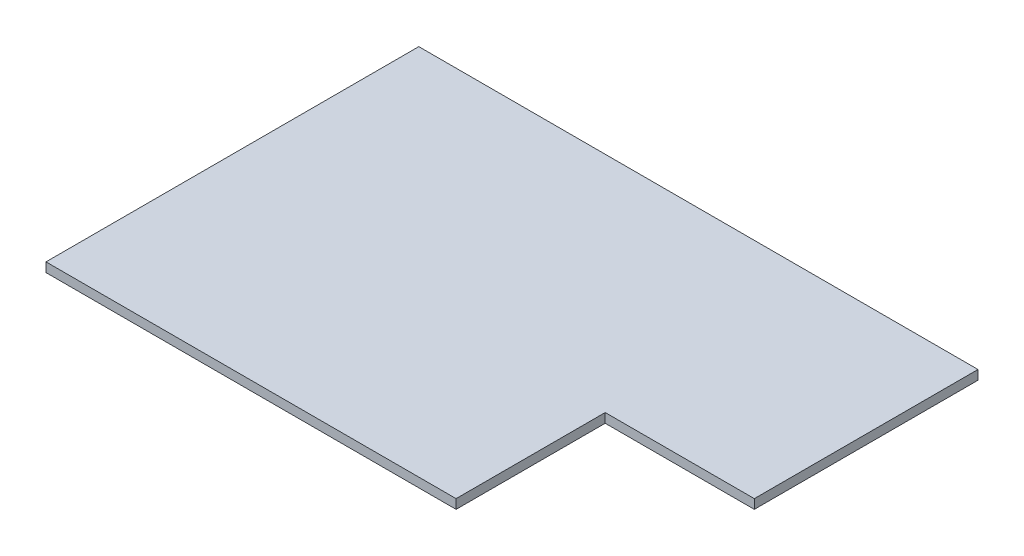
ISO-10303-21;
HEADER;
FILE_DESCRIPTION(('STEP AP214'),'2;1');
FILE_NAME('part.step','',(''),(''),'','','');
FILE_SCHEMA(('AUTOMOTIVE_DESIGN { 1 0 10303 214 1 1 1 1 }'));
ENDSEC;
DATA;
#1=APPLICATION_CONTEXT('core data for automotive mechanical design processes');
#2=APPLICATION_PROTOCOL_DEFINITION('international standard','automotive_design',2000,#1);
#3=PRODUCT_CONTEXT('',#1,'mechanical');
#4=PRODUCT('Part','Part','',(#3));
#5=PRODUCT_RELATED_PRODUCT_CATEGORY('part','',(#4));
#6=PRODUCT_DEFINITION_FORMATION('','',#4);
#7=PRODUCT_DEFINITION_CONTEXT('part definition',#1,'design');
#8=PRODUCT_DEFINITION('design','',#6,#7);
#9=PRODUCT_DEFINITION_SHAPE('','',#8);
#10=(LENGTH_UNIT() NAMED_UNIT(*) SI_UNIT(.MILLI.,.METRE.));
#11=(NAMED_UNIT(*) PLANE_ANGLE_UNIT() SI_UNIT($,.RADIAN.));
#12=(NAMED_UNIT(*) SI_UNIT($,.STERADIAN.) SOLID_ANGLE_UNIT());
#13=UNCERTAINTY_MEASURE_WITH_UNIT(LENGTH_MEASURE(1.E-05),#10,'distance_accuracy_value','');
#14=(GEOMETRIC_REPRESENTATION_CONTEXT(3) GLOBAL_UNCERTAINTY_ASSIGNED_CONTEXT((#13)) GLOBAL_UNIT_ASSIGNED_CONTEXT((#10,
#11,#12)) REPRESENTATION_CONTEXT('',''));
#15=CARTESIAN_POINT('',(0.,0.,0.));
#16=DIRECTION('',(0.,0.,1.));
#17=DIRECTION('',(1.,0.,0.));
#18=AXIS2_PLACEMENT_3D('',#15,#16,#17);
#19=CARTESIAN_POINT('',(95.25,3.175,63.5));
#20=DIRECTION('',(-1.,0.,0.));
#21=DIRECTION('',(0.,0.,1.));
#22=AXIS2_PLACEMENT_3D('',#19,#20,#21);
#23=PLANE('',#22);
#24=DIRECTION('',(0.,0.,-1.));
#25=VECTOR('',#24,1.);
#26=CARTESIAN_POINT('',(95.25,3.175,63.5));
#27=LINE('',#26,#25);
#28=CARTESIAN_POINT('',(95.25,3.175,12.7));
#29=VERTEX_POINT('',#28);
#30=CARTESIAN_POINT('',(95.25,3.175,-63.5));
#31=VERTEX_POINT('',#30);
#32=EDGE_CURVE('E79',#29,#31,#27,.T.);
#33=ORIENTED_EDGE('',*,*,#32,.F.);
#34=DIRECTION('',(0.,1.,0.));
#35=VECTOR('',#34,1.);
#36=CARTESIAN_POINT('',(95.25,0.,12.7));
#37=LINE('',#36,#35);
#38=CARTESIAN_POINT('',(95.25,0.,12.7));
#39=VERTEX_POINT('',#38);
#40=EDGE_CURVE('E99',#39,#29,#37,.T.);
#41=ORIENTED_EDGE('',*,*,#40,.F.);
#42=DIRECTION('',(0.,0.,-1.));
#43=VECTOR('',#42,1.);
#44=CARTESIAN_POINT('',(95.25,0.,63.5));
#45=LINE('',#44,#43);
#46=CARTESIAN_POINT('',(95.25,0.,-63.5));
#47=VERTEX_POINT('',#46);
#48=EDGE_CURVE('E107',#39,#47,#45,.T.);
#49=ORIENTED_EDGE('',*,*,#48,.T.);
#50=DIRECTION('',(0.,-1.,0.));
#51=VECTOR('',#50,1.);
#52=CARTESIAN_POINT('',(95.25,3.175,-63.5));
#53=LINE('',#52,#51);
#54=EDGE_CURVE('E11',#31,#47,#53,.T.);
#55=ORIENTED_EDGE('',*,*,#54,.F.);
#56=EDGE_LOOP('',(#33,#41,#49,#55));
#57=FACE_BOUND('',#56,.T.);
#58=ADVANCED_FACE('F34',(#57),#23,.F.);
#59=CARTESIAN_POINT('',(-95.25,3.175,-63.5));
#60=DIRECTION('',(0.,0.,1.));
#61=DIRECTION('',(1.,0.,0.));
#62=AXIS2_PLACEMENT_3D('',#59,#60,#61);
#63=PLANE('',#62);
#64=DIRECTION('',(-1.,0.,0.));
#65=VECTOR('',#64,1.);
#66=CARTESIAN_POINT('',(-95.25,0.,-63.5));
#67=LINE('',#66,#65);
#68=CARTESIAN_POINT('',(-95.25,0.,-63.5));
#69=VERTEX_POINT('',#68);
#70=EDGE_CURVE('E111',#47,#69,#67,.T.);
#71=ORIENTED_EDGE('',*,*,#70,.T.);
#72=DIRECTION('',(0.,-1.,0.));
#73=VECTOR('',#72,1.);
#74=CARTESIAN_POINT('',(-95.25,3.175,-63.5));
#75=LINE('',#74,#73);
#76=CARTESIAN_POINT('',(-95.25,3.175,-63.5));
#77=VERTEX_POINT('',#76);
#78=EDGE_CURVE('E41',#77,#69,#75,.T.);
#79=ORIENTED_EDGE('',*,*,#78,.F.);
#80=DIRECTION('',(-1.,0.,0.));
#81=VECTOR('',#80,1.);
#82=CARTESIAN_POINT('',(-95.25,3.175,-63.5));
#83=LINE('',#82,#81);
#84=EDGE_CURVE('E134',#31,#77,#83,.T.);
#85=ORIENTED_EDGE('',*,*,#84,.F.);
#86=ORIENTED_EDGE('',*,*,#54,.T.);
#87=EDGE_LOOP('',(#71,#79,#85,#86));
#88=FACE_BOUND('',#87,.T.);
#89=ADVANCED_FACE('F153',(#88),#63,.F.);
#90=CARTESIAN_POINT('',(-95.25,3.175,63.5));
#91=DIRECTION('',(1.,0.,0.));
#92=DIRECTION('',(0.,0.,-1.));
#93=AXIS2_PLACEMENT_3D('',#90,#91,#92);
#94=PLANE('',#93);
#95=DIRECTION('',(0.,0.,1.));
#96=VECTOR('',#95,1.);
#97=CARTESIAN_POINT('',(-95.25,0.,63.5));
#98=LINE('',#97,#96);
#99=CARTESIAN_POINT('',(-95.25,0.,63.5));
#100=VERTEX_POINT('',#99);
#101=EDGE_CURVE('E74',#69,#100,#98,.T.);
#102=ORIENTED_EDGE('',*,*,#101,.T.);
#103=DIRECTION('',(0.,-1.,0.));
#104=VECTOR('',#103,1.);
#105=CARTESIAN_POINT('',(-95.25,3.175,63.5));
#106=LINE('',#105,#104);
#107=CARTESIAN_POINT('',(-95.25,3.175,63.5));
#108=VERTEX_POINT('',#107);
#109=EDGE_CURVE('E125',#108,#100,#106,.T.);
#110=ORIENTED_EDGE('',*,*,#109,.F.);
#111=DIRECTION('',(0.,0.,1.));
#112=VECTOR('',#111,1.);
#113=CARTESIAN_POINT('',(-95.25,3.175,63.5));
#114=LINE('',#113,#112);
#115=EDGE_CURVE('E57',#77,#108,#114,.T.);
#116=ORIENTED_EDGE('',*,*,#115,.F.);
#117=ORIENTED_EDGE('',*,*,#78,.T.);
#118=EDGE_LOOP('',(#102,#110,#116,#117));
#119=FACE_BOUND('',#118,.T.);
#120=ADVANCED_FACE('F127',(#119),#94,.F.);
#121=CARTESIAN_POINT('',(-95.25,3.175,63.5));
#122=DIRECTION('',(0.,0.,-1.));
#123=DIRECTION('',(-1.,0.,0.));
#124=AXIS2_PLACEMENT_3D('',#121,#122,#123);
#125=PLANE('',#124);
#126=DIRECTION('',(1.,0.,0.));
#127=VECTOR('',#126,1.);
#128=CARTESIAN_POINT('',(-95.25,0.,63.5));
#129=LINE('',#128,#127);
#130=CARTESIAN_POINT('',(44.45,0.,63.5));
#131=VERTEX_POINT('',#130);
#132=EDGE_CURVE('E122',#100,#131,#129,.T.);
#133=ORIENTED_EDGE('',*,*,#132,.T.);
#134=DIRECTION('',(0.,1.,0.));
#135=VECTOR('',#134,1.);
#136=CARTESIAN_POINT('',(44.45,0.,63.5));
#137=LINE('',#136,#135);
#138=CARTESIAN_POINT('',(44.45,3.175,63.5));
#139=VERTEX_POINT('',#138);
#140=EDGE_CURVE('E112',#131,#139,#137,.T.);
#141=ORIENTED_EDGE('',*,*,#140,.T.);
#142=DIRECTION('',(1.,0.,0.));
#143=VECTOR('',#142,1.);
#144=CARTESIAN_POINT('',(-95.25,3.175,63.5));
#145=LINE('',#144,#143);
#146=EDGE_CURVE('E118',#108,#139,#145,.T.);
#147=ORIENTED_EDGE('',*,*,#146,.F.);
#148=ORIENTED_EDGE('',*,*,#109,.T.);
#149=EDGE_LOOP('',(#133,#141,#147,#148));
#150=FACE_BOUND('',#149,.T.);
#151=ADVANCED_FACE('F131',(#150),#125,.F.);
#152=CARTESIAN_POINT('',(0.,3.175,0.));
#153=DIRECTION('',(0.,-1.,0.));
#154=DIRECTION('',(0.,0.,-1.));
#155=AXIS2_PLACEMENT_3D('',#152,#153,#154);
#156=PLANE('',#155);
#157=ORIENTED_EDGE('',*,*,#146,.T.);
#158=DIRECTION('',(0.,0.,1.));
#159=VECTOR('',#158,1.);
#160=CARTESIAN_POINT('',(44.45,3.175,63.5));
#161=LINE('',#160,#159);
#162=CARTESIAN_POINT('',(44.45,3.175,12.7));
#163=VERTEX_POINT('',#162);
#164=EDGE_CURVE('E103',#163,#139,#161,.T.);
#165=ORIENTED_EDGE('',*,*,#164,.F.);
#166=DIRECTION('',(-1.,0.,0.));
#167=VECTOR('',#166,1.);
#168=CARTESIAN_POINT('',(95.25,3.175,12.7));
#169=LINE('',#168,#167);
#170=EDGE_CURVE('E140',#29,#163,#169,.T.);
#171=ORIENTED_EDGE('',*,*,#170,.F.);
#172=ORIENTED_EDGE('',*,*,#32,.T.);
#173=ORIENTED_EDGE('',*,*,#84,.T.);
#174=ORIENTED_EDGE('',*,*,#115,.T.);
#175=EDGE_LOOP('',(#157,#165,#171,#172,#173,#174));
#176=FACE_BOUND('',#175,.T.);
#177=ADVANCED_FACE('F142',(#176),#156,.F.);
#178=CARTESIAN_POINT('',(0.,0.,0.));
#179=DIRECTION('',(0.,-1.,0.));
#180=DIRECTION('',(0.,0.,-1.));
#181=AXIS2_PLACEMENT_3D('',#178,#179,#180);
#182=PLANE('',#181);
#183=DIRECTION('',(0.,0.,1.));
#184=VECTOR('',#183,1.);
#185=CARTESIAN_POINT('',(44.45,0.,63.5));
#186=LINE('',#185,#184);
#187=CARTESIAN_POINT('',(44.45,0.,12.7));
#188=VERTEX_POINT('',#187);
#189=EDGE_CURVE('E48',#188,#131,#186,.T.);
#190=ORIENTED_EDGE('',*,*,#189,.T.);
#191=ORIENTED_EDGE('',*,*,#132,.F.);
#192=ORIENTED_EDGE('',*,*,#101,.F.);
#193=ORIENTED_EDGE('',*,*,#70,.F.);
#194=ORIENTED_EDGE('',*,*,#48,.F.);
#195=DIRECTION('',(-1.,0.,0.));
#196=VECTOR('',#195,1.);
#197=CARTESIAN_POINT('',(95.25,0.,12.7));
#198=LINE('',#197,#196);
#199=EDGE_CURVE('E95',#39,#188,#198,.T.);
#200=ORIENTED_EDGE('',*,*,#199,.T.);
#201=EDGE_LOOP('',(#190,#191,#192,#193,#194,#200));
#202=FACE_BOUND('',#201,.T.);
#203=ADVANCED_FACE('F110',(#202),#182,.T.);
#204=CARTESIAN_POINT('',(44.45,0.,63.5));
#205=DIRECTION('',(-1.,0.,0.));
#206=DIRECTION('',(0.,0.,1.));
#207=AXIS2_PLACEMENT_3D('',#204,#205,#206);
#208=PLANE('',#207);
#209=ORIENTED_EDGE('',*,*,#164,.T.);
#210=ORIENTED_EDGE('',*,*,#140,.F.);
#211=ORIENTED_EDGE('',*,*,#189,.F.);
#212=DIRECTION('',(0.,1.,0.));
#213=VECTOR('',#212,1.);
#214=CARTESIAN_POINT('',(44.45,0.,12.7));
#215=LINE('',#214,#213);
#216=EDGE_CURVE('E100',#188,#163,#215,.T.);
#217=ORIENTED_EDGE('',*,*,#216,.T.);
#218=EDGE_LOOP('',(#209,#210,#211,#217));
#219=FACE_BOUND('',#218,.T.);
#220=ADVANCED_FACE('F143',(#219),#208,.F.);
#221=CARTESIAN_POINT('',(95.25,0.,12.7));
#222=DIRECTION('',(0.,0.,-1.));
#223=DIRECTION('',(-1.,0.,0.));
#224=AXIS2_PLACEMENT_3D('',#221,#222,#223);
#225=PLANE('',#224);
#226=ORIENTED_EDGE('',*,*,#170,.T.);
#227=ORIENTED_EDGE('',*,*,#216,.F.);
#228=ORIENTED_EDGE('',*,*,#199,.F.);
#229=ORIENTED_EDGE('',*,*,#40,.T.);
#230=EDGE_LOOP('',(#226,#227,#228,#229));
#231=FACE_BOUND('',#230,.T.);
#232=ADVANCED_FACE('F98',(#231),#225,.F.);
#233=CLOSED_SHELL('',(#58,#89,#120,#151,#177,#203,#220,#232));
#234=MANIFOLD_SOLID_BREP('B2',#233);
#235=ADVANCED_BREP_SHAPE_REPRESENTATION('',(#18,#234),#14);
#236=SHAPE_DEFINITION_REPRESENTATION(#9,#235);
ENDSEC;
END-ISO-10303-21;
